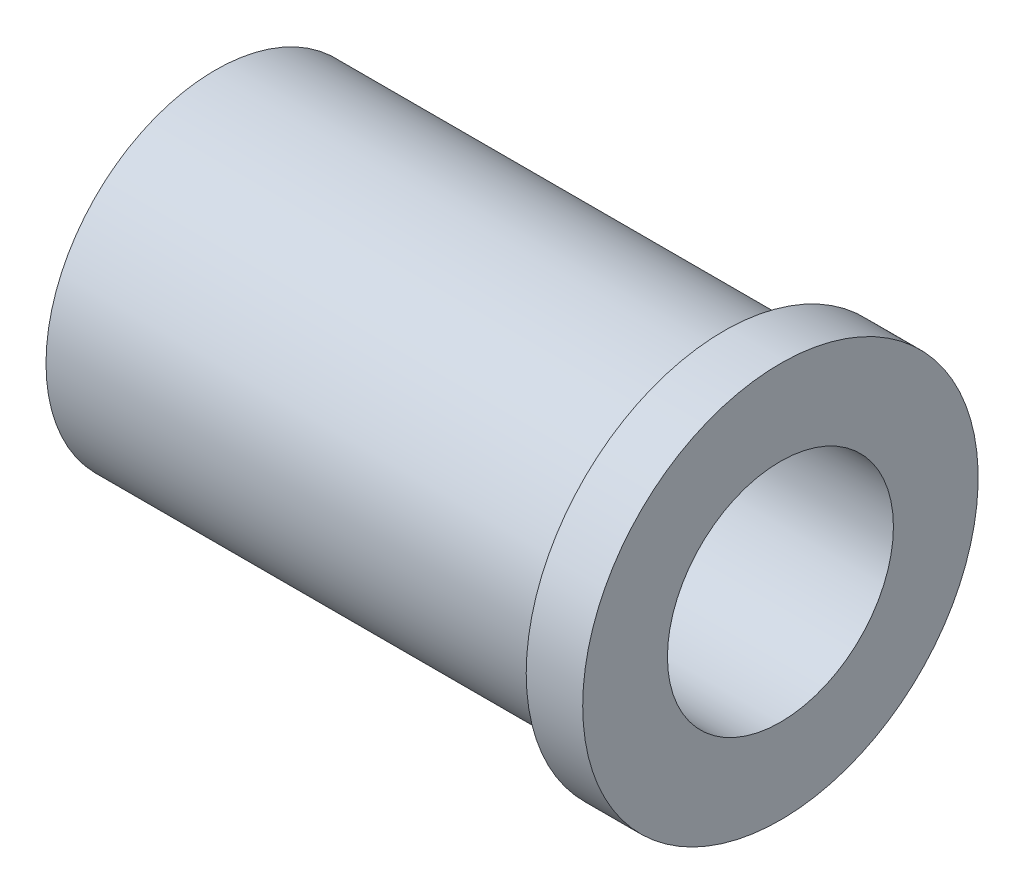
ISO-10303-21;
HEADER;
FILE_DESCRIPTION(('STEP AP214'),'2;1');
FILE_NAME('part.step','',(''),(''),'','','');
FILE_SCHEMA(('AUTOMOTIVE_DESIGN { 1 0 10303 214 1 1 1 1 }'));
ENDSEC;
DATA;
#1=APPLICATION_CONTEXT('core data for automotive mechanical design processes');
#2=APPLICATION_PROTOCOL_DEFINITION('international standard','automotive_design',2000,#1);
#3=PRODUCT_CONTEXT('',#1,'mechanical');
#4=PRODUCT('Part','Part','',(#3));
#5=PRODUCT_RELATED_PRODUCT_CATEGORY('part','',(#4));
#6=PRODUCT_DEFINITION_FORMATION('','',#4);
#7=PRODUCT_DEFINITION_CONTEXT('part definition',#1,'design');
#8=PRODUCT_DEFINITION('design','',#6,#7);
#9=PRODUCT_DEFINITION_SHAPE('','',#8);
#10=(LENGTH_UNIT() NAMED_UNIT(*) SI_UNIT(.MILLI.,.METRE.));
#11=(NAMED_UNIT(*) PLANE_ANGLE_UNIT() SI_UNIT($,.RADIAN.));
#12=(NAMED_UNIT(*) SI_UNIT($,.STERADIAN.) SOLID_ANGLE_UNIT());
#13=UNCERTAINTY_MEASURE_WITH_UNIT(LENGTH_MEASURE(1.E-05),#10,'distance_accuracy_value','');
#14=(GEOMETRIC_REPRESENTATION_CONTEXT(3) GLOBAL_UNCERTAINTY_ASSIGNED_CONTEXT((#13)) GLOBAL_UNIT_ASSIGNED_CONTEXT((#10,
#11,#12)) REPRESENTATION_CONTEXT('',''));
#15=CARTESIAN_POINT('',(0.,0.,0.));
#16=DIRECTION('',(0.,0.,1.));
#17=DIRECTION('',(1.,0.,0.));
#18=AXIS2_PLACEMENT_3D('',#15,#16,#17);
#19=CARTESIAN_POINT('',(0.,20.,0.));
#20=DIRECTION('',(-1.,0.,0.));
#21=DIRECTION('',(0.,0.,1.));
#22=AXIS2_PLACEMENT_3D('',#19,#20,#21);
#23=PLANE('',#22);
#24=CARTESIAN_POINT('',(0.,0.,0.));
#25=DIRECTION('',(-1.,0.,0.));
#26=DIRECTION('',(0.,0.,1.));
#27=AXIS2_PLACEMENT_3D('',#24,#25,#26);
#28=CIRCLE('',#27,24.);
#29=CARTESIAN_POINT('',(0.,0.,24.));
#30=VERTEX_POINT('',#29);
#31=EDGE_CURVE('E12',#30,#30,#28,.F.);
#32=ORIENTED_EDGE('',*,*,#31,.T.);
#33=EDGE_LOOP('',(#32));
#34=FACE_BOUND('',#33,.T.);
#35=CARTESIAN_POINT('',(0.,0.,0.));
#36=DIRECTION('',(-1.,0.,0.));
#37=DIRECTION('',(0.,0.,1.));
#38=AXIS2_PLACEMENT_3D('',#35,#36,#37);
#39=CIRCLE('',#38,30.);
#40=CARTESIAN_POINT('',(0.,0.,30.));
#41=VERTEX_POINT('',#40);
#42=EDGE_CURVE('E54',#41,#41,#39,.T.);
#43=ORIENTED_EDGE('',*,*,#42,.T.);
#44=EDGE_LOOP('',(#43));
#45=FACE_BOUND('',#44,.T.);
#46=ADVANCED_FACE('F43',(#34,#45),#23,.T.);
#47=CARTESIAN_POINT('',(0.,0.,0.));
#48=DIRECTION('',(-1.,0.,0.));
#49=DIRECTION('',(0.,0.,1.));
#50=AXIS2_PLACEMENT_3D('',#47,#48,#49);
#51=CYLINDRICAL_SURFACE('',#50,30.);
#52=CARTESIAN_POINT('',(90.,0.,0.));
#53=DIRECTION('',(-1.,0.,0.));
#54=DIRECTION('',(0.,0.,1.));
#55=AXIS2_PLACEMENT_3D('',#52,#53,#54);
#56=CIRCLE('',#55,30.);
#57=CARTESIAN_POINT('',(90.,0.,30.));
#58=VERTEX_POINT('',#57);
#59=EDGE_CURVE('E58',#58,#58,#56,.T.);
#60=ORIENTED_EDGE('',*,*,#59,.T.);
#61=EDGE_LOOP('',(#60));
#62=FACE_BOUND('',#61,.T.);
#63=ORIENTED_EDGE('',*,*,#42,.F.);
#64=EDGE_LOOP('',(#63));
#65=FACE_BOUND('',#64,.T.);
#66=ADVANCED_FACE('F87',(#62,#65),#51,.T.);
#67=CARTESIAN_POINT('',(90.,30.,0.));
#68=DIRECTION('',(-1.,0.,0.));
#69=DIRECTION('',(0.,0.,1.));
#70=AXIS2_PLACEMENT_3D('',#67,#68,#69);
#71=PLANE('',#70);
#72=CARTESIAN_POINT('',(90.,0.,0.));
#73=DIRECTION('',(-1.,0.,0.));
#74=DIRECTION('',(0.,0.,1.));
#75=AXIS2_PLACEMENT_3D('',#72,#73,#74);
#76=CIRCLE('',#75,35.);
#77=CARTESIAN_POINT('',(90.,0.,35.));
#78=VERTEX_POINT('',#77);
#79=EDGE_CURVE('E63',#78,#78,#76,.T.);
#80=ORIENTED_EDGE('',*,*,#79,.T.);
#81=EDGE_LOOP('',(#80));
#82=FACE_BOUND('',#81,.T.);
#83=ORIENTED_EDGE('',*,*,#59,.F.);
#84=EDGE_LOOP('',(#83));
#85=FACE_BOUND('',#84,.T.);
#86=ADVANCED_FACE('F91',(#82,#85),#71,.T.);
#87=CARTESIAN_POINT('',(0.,0.,0.));
#88=DIRECTION('',(-1.,0.,0.));
#89=DIRECTION('',(0.,0.,1.));
#90=AXIS2_PLACEMENT_3D('',#87,#88,#89);
#91=CYLINDRICAL_SURFACE('',#90,35.);
#92=ORIENTED_EDGE('',*,*,#79,.F.);
#93=EDGE_LOOP('',(#92));
#94=FACE_BOUND('',#93,.T.);
#95=CARTESIAN_POINT('',(100.,0.,0.));
#96=DIRECTION('',(-1.,0.,0.));
#97=DIRECTION('',(0.,0.,1.));
#98=AXIS2_PLACEMENT_3D('',#95,#96,#97);
#99=CIRCLE('',#98,35.);
#100=CARTESIAN_POINT('',(100.,0.,35.));
#101=VERTEX_POINT('',#100);
#102=EDGE_CURVE('E66',#101,#101,#99,.T.);
#103=ORIENTED_EDGE('',*,*,#102,.T.);
#104=EDGE_LOOP('',(#103));
#105=FACE_BOUND('',#104,.T.);
#106=ADVANCED_FACE('F83',(#94,#105),#91,.T.);
#107=CARTESIAN_POINT('',(100.,20.,0.));
#108=DIRECTION('',(-1.,0.,0.));
#109=DIRECTION('',(0.,0.,1.));
#110=AXIS2_PLACEMENT_3D('',#107,#108,#109);
#111=PLANE('',#110);
#112=ORIENTED_EDGE('',*,*,#102,.F.);
#113=EDGE_LOOP('',(#112));
#114=FACE_BOUND('',#113,.T.);
#115=CARTESIAN_POINT('',(100.,0.,0.));
#116=DIRECTION('',(-1.,0.,0.));
#117=DIRECTION('',(0.,0.,1.));
#118=AXIS2_PLACEMENT_3D('',#115,#116,#117);
#119=CIRCLE('',#118,20.);
#120=CARTESIAN_POINT('',(100.,0.,20.));
#121=VERTEX_POINT('',#120);
#122=EDGE_CURVE('E69',#121,#121,#119,.T.);
#123=ORIENTED_EDGE('',*,*,#122,.T.);
#124=EDGE_LOOP('',(#123));
#125=FACE_BOUND('',#124,.T.);
#126=ADVANCED_FACE('F73',(#114,#125),#111,.F.);
#127=CARTESIAN_POINT('',(0.,0.,0.));
#128=DIRECTION('',(-1.,0.,0.));
#129=DIRECTION('',(0.,0.,1.));
#130=AXIS2_PLACEMENT_3D('',#127,#128,#129);
#131=CYLINDRICAL_SURFACE('',#130,20.);
#132=CARTESIAN_POINT('',(4.,0.,0.));
#133=DIRECTION('',(-1.,0.,0.));
#134=DIRECTION('',(0.,0.,1.));
#135=AXIS2_PLACEMENT_3D('',#132,#133,#134);
#136=CIRCLE('',#135,20.);
#137=CARTESIAN_POINT('',(4.,0.,20.));
#138=VERTEX_POINT('',#137);
#139=EDGE_CURVE('E50',#138,#138,#136,.T.);
#140=ORIENTED_EDGE('',*,*,#139,.T.);
#141=EDGE_LOOP('',(#140));
#142=FACE_BOUND('',#141,.T.);
#143=ORIENTED_EDGE('',*,*,#122,.F.);
#144=EDGE_LOOP('',(#143));
#145=FACE_BOUND('',#144,.T.);
#146=ADVANCED_FACE('F75',(#142,#145),#131,.F.);
#147=CARTESIAN_POINT('',(4.,0.,0.));
#148=DIRECTION('',(-1.,0.,0.));
#149=DIRECTION('',(0.,0.,1.));
#150=AXIS2_PLACEMENT_3D('',#147,#148,#149);
#151=TOROIDAL_SURFACE('',#150,24.,4.);
#152=ORIENTED_EDGE('',*,*,#31,.F.);
#153=EDGE_LOOP('',(#152));
#154=FACE_BOUND('',#153,.T.);
#155=ORIENTED_EDGE('',*,*,#139,.F.);
#156=EDGE_LOOP('',(#155));
#157=FACE_BOUND('',#156,.T.);
#158=ADVANCED_FACE('F45',(#154,#157),#151,.T.);
#159=CLOSED_SHELL('',(#46,#66,#86,#106,#126,#146,#158));
#160=MANIFOLD_SOLID_BREP('B2',#159);
#161=ADVANCED_BREP_SHAPE_REPRESENTATION('',(#18,#160),#14);
#162=SHAPE_DEFINITION_REPRESENTATION(#9,#161);
ENDSEC;
END-ISO-10303-21;
